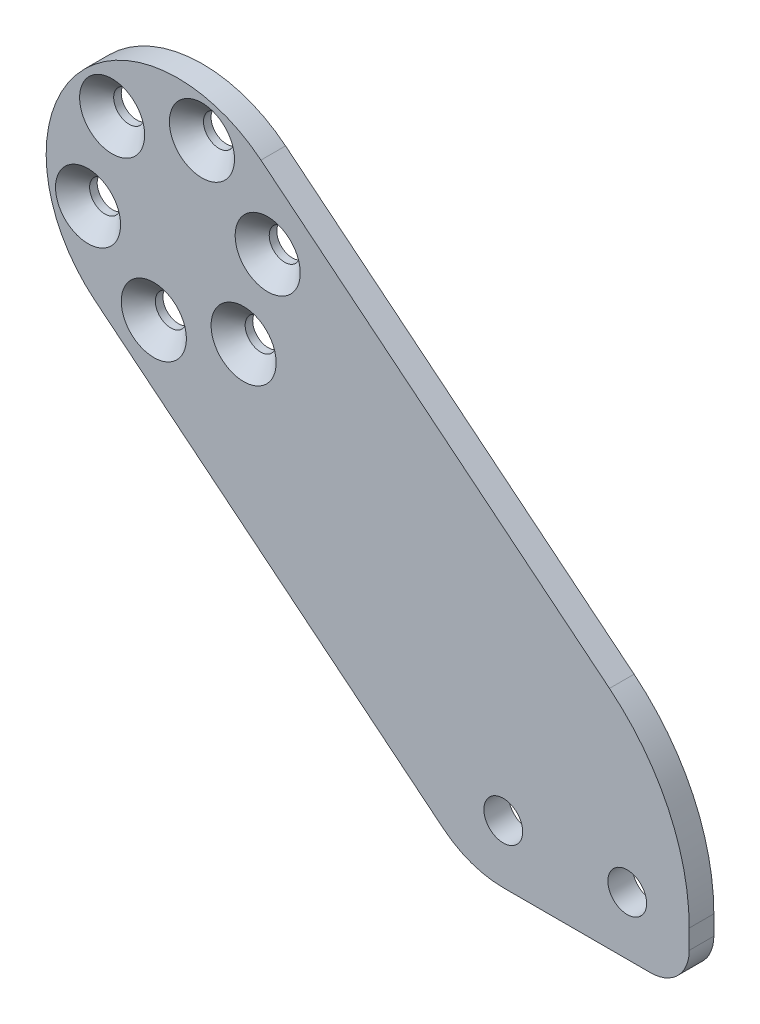
ISO-10303-21;
HEADER;
FILE_DESCRIPTION(('STEP AP214'),'2;1');
FILE_NAME('part.step','',(''),(''),'','','');
FILE_SCHEMA(('AUTOMOTIVE_DESIGN { 1 0 10303 214 1 1 1 1 }'));
ENDSEC;
DATA;
#1=APPLICATION_CONTEXT('core data for automotive mechanical design processes');
#2=APPLICATION_PROTOCOL_DEFINITION('international standard','automotive_design',2000,#1);
#3=PRODUCT_CONTEXT('',#1,'mechanical');
#4=PRODUCT('Part','Part','',(#3));
#5=PRODUCT_RELATED_PRODUCT_CATEGORY('part','',(#4));
#6=PRODUCT_DEFINITION_FORMATION('','',#4);
#7=PRODUCT_DEFINITION_CONTEXT('part definition',#1,'design');
#8=PRODUCT_DEFINITION('design','',#6,#7);
#9=PRODUCT_DEFINITION_SHAPE('','',#8);
#10=(LENGTH_UNIT() NAMED_UNIT(*) SI_UNIT(.MILLI.,.METRE.));
#11=(NAMED_UNIT(*) PLANE_ANGLE_UNIT() SI_UNIT($,.RADIAN.));
#12=(NAMED_UNIT(*) SI_UNIT($,.STERADIAN.) SOLID_ANGLE_UNIT());
#13=UNCERTAINTY_MEASURE_WITH_UNIT(LENGTH_MEASURE(1.E-05),#10,'distance_accuracy_value','');
#14=(GEOMETRIC_REPRESENTATION_CONTEXT(3) GLOBAL_UNCERTAINTY_ASSIGNED_CONTEXT((#13)) GLOBAL_UNIT_ASSIGNED_CONTEXT((#10,
#11,#12)) REPRESENTATION_CONTEXT('',''));
#15=CARTESIAN_POINT('',(0.,0.,0.));
#16=DIRECTION('',(0.,0.,1.));
#17=DIRECTION('',(1.,0.,0.));
#18=AXIS2_PLACEMENT_3D('',#15,#16,#17);
#19=CARTESIAN_POINT('',(38.1233103289566,-45.,3.175));
#20=DIRECTION('',(0.,0.,-1.));
#21=DIRECTION('',(-1.,0.,0.));
#22=AXIS2_PLACEMENT_3D('',#19,#20,#21);
#23=PLANE('',#22);
#24=CARTESIAN_POINT('',(8.48528137423854,-8.48528137423861,3.175));
#25=DIRECTION('',(0.,0.,-1.));
#26=DIRECTION('',(-1.,0.,0.));
#27=AXIS2_PLACEMENT_3D('',#24,#25,#26);
#28=CIRCLE('',#27,4.19999999999997);
#29=CARTESIAN_POINT('',(4.28528137423857,-8.48528137423861,3.175));
#30=VERTEX_POINT('',#29);
#31=EDGE_CURVE('E163',#30,#30,#28,.T.);
#32=ORIENTED_EDGE('',*,*,#31,.T.);
#33=EDGE_LOOP('',(#32));
#34=FACE_BOUND('',#33,.T.);
#35=CARTESIAN_POINT('',(-3.10582854123031,-11.5911099154688,3.175));
#36=DIRECTION('',(0.,0.,-1.));
#37=DIRECTION('',(-1.,0.,0.));
#38=AXIS2_PLACEMENT_3D('',#35,#36,#37);
#39=CIRCLE('',#38,4.19999999999997);
#40=CARTESIAN_POINT('',(-7.30582854123027,-11.5911099154688,3.175));
#41=VERTEX_POINT('',#40);
#42=EDGE_CURVE('E160',#41,#41,#39,.T.);
#43=ORIENTED_EDGE('',*,*,#42,.T.);
#44=EDGE_LOOP('',(#43));
#45=FACE_BOUND('',#44,.T.);
#46=CARTESIAN_POINT('',(-11.5911099154688,-3.10582854123021,3.175));
#47=DIRECTION('',(0.,0.,-1.));
#48=DIRECTION('',(-1.,0.,0.));
#49=AXIS2_PLACEMENT_3D('',#46,#47,#48);
#50=CIRCLE('',#49,4.2);
#51=CARTESIAN_POINT('',(-15.7911099154688,-3.10582854123021,3.175));
#52=VERTEX_POINT('',#51);
#53=EDGE_CURVE('E157',#52,#52,#50,.T.);
#54=ORIENTED_EDGE('',*,*,#53,.T.);
#55=EDGE_LOOP('',(#54));
#56=FACE_BOUND('',#55,.T.);
#57=CARTESIAN_POINT('',(-8.48528137423853,8.48528137423861,3.175));
#58=DIRECTION('',(0.,0.,-1.));
#59=DIRECTION('',(-1.,0.,0.));
#60=AXIS2_PLACEMENT_3D('',#57,#58,#59);
#61=CIRCLE('',#60,4.20000000000001);
#62=CARTESIAN_POINT('',(-12.6852813742385,8.48528137423861,3.175));
#63=VERTEX_POINT('',#62);
#64=EDGE_CURVE('E154',#63,#63,#61,.T.);
#65=ORIENTED_EDGE('',*,*,#64,.T.);
#66=EDGE_LOOP('',(#65));
#67=FACE_BOUND('',#66,.T.);
#68=CARTESIAN_POINT('',(11.5911099154688,3.10582854123019,3.175));
#69=DIRECTION('',(0.,0.,-1.));
#70=DIRECTION('',(-1.,0.,0.));
#71=AXIS2_PLACEMENT_3D('',#68,#69,#70);
#72=CIRCLE('',#71,4.2);
#73=CARTESIAN_POINT('',(7.39110991546884,3.10582854123019,3.175));
#74=VERTEX_POINT('',#73);
#75=EDGE_CURVE('E151',#74,#74,#72,.T.);
#76=ORIENTED_EDGE('',*,*,#75,.T.);
#77=EDGE_LOOP('',(#76));
#78=FACE_BOUND('',#77,.T.);
#79=CARTESIAN_POINT('',(3.1058285412303,11.5911099154688,3.175));
#80=DIRECTION('',(0.,0.,-1.));
#81=DIRECTION('',(-1.,0.,0.));
#82=AXIS2_PLACEMENT_3D('',#79,#80,#81);
#83=CIRCLE('',#82,4.20000000000001);
#84=CARTESIAN_POINT('',(7.30582854123031,11.5911099154688,3.175));
#85=VERTEX_POINT('',#84);
#86=EDGE_CURVE('E148',#85,#85,#83,.T.);
#87=ORIENTED_EDGE('',*,*,#86,.T.);
#88=EDGE_LOOP('',(#87));
#89=FACE_BOUND('',#88,.T.);
#90=DIRECTION('',(1.,0.,0.));
#91=VECTOR('',#90,1.);
#92=CARTESIAN_POINT('',(42.,-52.5,3.175));
#93=LINE('',#92,#91);
#94=CARTESIAN_POINT('',(42.,-52.5000000000001,3.175));
#95=VERTEX_POINT('',#94);
#96=CARTESIAN_POINT('',(61.,-52.5,3.175));
#97=VERTEX_POINT('',#96);
#98=EDGE_CURVE('E310',#95,#97,#93,.T.);
#99=ORIENTED_EDGE('',*,*,#98,.T.);
#100=CARTESIAN_POINT('',(61.,-47.5,3.175));
#101=DIRECTION('',(0.,0.,-1.));
#102=DIRECTION('',(-1.,0.,0.));
#103=AXIS2_PLACEMENT_3D('',#100,#101,#102);
#104=CIRCLE('',#103,5.);
#105=CARTESIAN_POINT('',(66.,-47.5,3.175));
#106=VERTEX_POINT('',#105);
#107=EDGE_CURVE('E143',#97,#106,#104,.F.);
#108=ORIENTED_EDGE('',*,*,#107,.T.);
#109=DIRECTION('',(0.,1.,0.));
#110=VECTOR('',#109,1.);
#111=CARTESIAN_POINT('',(66.,-45.,3.175));
#112=LINE('',#111,#110);
#113=CARTESIAN_POINT('',(66.,-45.,3.175));
#114=VERTEX_POINT('',#113);
#115=EDGE_CURVE('E124',#106,#114,#112,.T.);
#116=ORIENTED_EDGE('',*,*,#115,.T.);
#117=CARTESIAN_POINT('',(38.1233103289566,-45.,3.175));
#118=DIRECTION('',(0.,0.,1.));
#119=DIRECTION('',(-1.,0.,0.));
#120=AXIS2_PLACEMENT_3D('',#117,#118,#119);
#121=CIRCLE('',#120,27.8766896710434);
#122=CARTESIAN_POINT('',(55.7051915212923,-23.3669863228849,3.175));
#123=VERTEX_POINT('',#122);
#124=EDGE_CURVE('E119',#114,#123,#121,.T.);
#125=ORIENTED_EDGE('',*,*,#124,.T.);
#126=DIRECTION('',(-0.776025199993032,0.63070190183301,0.));
#127=VECTOR('',#126,1.);
#128=CARTESIAN_POINT('',(55.7051915212923,-23.3669863228849,3.175));
#129=LINE('',#128,#127);
#130=CARTESIAN_POINT('',(10.7219323311611,13.1924283998815,3.175));
#131=VERTEX_POINT('',#130);
#132=EDGE_CURVE('E108',#123,#131,#129,.T.);
#133=ORIENTED_EDGE('',*,*,#132,.T.);
#134=CARTESIAN_POINT('',(0.,0.,3.175));
#135=DIRECTION('',(0.,0.,1.));
#136=DIRECTION('',(1.,0.,0.));
#137=AXIS2_PLACEMENT_3D('',#134,#135,#136);
#138=CIRCLE('',#137,17.);
#139=CARTESIAN_POINT('',(-10.7219323311612,-13.1924283998815,3.175));
#140=VERTEX_POINT('',#139);
#141=EDGE_CURVE('E118',#131,#140,#138,.T.);
#142=ORIENTED_EDGE('',*,*,#141,.T.);
#143=DIRECTION('',(0.776025199993032,-0.63070190183301,0.));
#144=VECTOR('',#143,1.);
#145=CARTESIAN_POINT('',(34.26132685897,-49.751843122648,3.175));
#146=LINE('',#145,#144);
#147=CARTESIAN_POINT('',(34.26132685897,-49.751843122648,3.175));
#148=VERTEX_POINT('',#147);
#149=EDGE_CURVE('E306',#140,#148,#146,.T.);
#150=ORIENTED_EDGE('',*,*,#149,.T.);
#151=CARTESIAN_POINT('',(42.,-40.2300621441937,3.175));
#152=DIRECTION('',(0.,0.,1.));
#153=DIRECTION('',(1.,0.,0.));
#154=AXIS2_PLACEMENT_3D('',#151,#152,#153);
#155=CIRCLE('',#154,12.2699378558064);
#156=EDGE_CURVE('E308',#148,#95,#155,.T.);
#157=ORIENTED_EDGE('',*,*,#156,.T.);
#158=EDGE_LOOP('',(#99,#108,#116,#125,#133,#142,#150,#157));
#159=FACE_BOUND('',#158,.T.);
#160=CARTESIAN_POINT('',(58.,-45.,3.175));
#161=DIRECTION('',(0.,0.,1.));
#162=DIRECTION('',(1.,0.,0.));
#163=AXIS2_PLACEMENT_3D('',#160,#161,#162);
#164=CIRCLE('',#163,2.49999999999994);
#165=CARTESIAN_POINT('',(60.4999999999999,-45.,3.175));
#166=VERTEX_POINT('',#165);
#167=EDGE_CURVE('E300',#166,#166,#164,.T.);
#168=ORIENTED_EDGE('',*,*,#167,.F.);
#169=EDGE_LOOP('',(#168));
#170=FACE_BOUND('',#169,.T.);
#171=CARTESIAN_POINT('',(42.,-45.,3.175));
#172=DIRECTION('',(0.,0.,1.));
#173=DIRECTION('',(1.,0.,0.));
#174=AXIS2_PLACEMENT_3D('',#171,#172,#173);
#175=CIRCLE('',#174,2.49999999999994);
#176=CARTESIAN_POINT('',(44.4999999999999,-45.,3.175));
#177=VERTEX_POINT('',#176);
#178=EDGE_CURVE('E294',#177,#177,#175,.T.);
#179=ORIENTED_EDGE('',*,*,#178,.F.);
#180=EDGE_LOOP('',(#179));
#181=FACE_BOUND('',#180,.T.);
#182=ADVANCED_FACE('F40',(#34,#45,#56,#67,#78,#89,#159,#170,#181),#23,.F.);
#183=CARTESIAN_POINT('',(38.1233103289566,-45.,0.));
#184=DIRECTION('',(0.,0.,-1.));
#185=DIRECTION('',(-1.,0.,0.));
#186=AXIS2_PLACEMENT_3D('',#183,#184,#185);
#187=PLANE('',#186);
#188=CARTESIAN_POINT('',(-3.10582854123031,-11.5911099154688,0.));
#189=DIRECTION('',(0.,0.,1.));
#190=DIRECTION('',(1.,0.,0.));
#191=AXIS2_PLACEMENT_3D('',#188,#189,#190);
#192=CIRCLE('',#191,2.);
#193=CARTESIAN_POINT('',(-1.10582854123031,-11.5911099154688,0.));
#194=VERTEX_POINT('',#193);
#195=EDGE_CURVE('E276',#194,#194,#192,.T.);
#196=ORIENTED_EDGE('',*,*,#195,.T.);
#197=EDGE_LOOP('',(#196));
#198=FACE_BOUND('',#197,.T.);
#199=CARTESIAN_POINT('',(11.5911099154688,3.10582854123019,0.));
#200=DIRECTION('',(0.,0.,1.));
#201=DIRECTION('',(1.,0.,0.));
#202=AXIS2_PLACEMENT_3D('',#199,#200,#201);
#203=CIRCLE('',#202,2.00000000000001);
#204=CARTESIAN_POINT('',(13.5911099154688,3.10582854123019,0.));
#205=VERTEX_POINT('',#204);
#206=EDGE_CURVE('E284',#205,#205,#203,.T.);
#207=ORIENTED_EDGE('',*,*,#206,.T.);
#208=EDGE_LOOP('',(#207));
#209=FACE_BOUND('',#208,.T.);
#210=CARTESIAN_POINT('',(-8.48528137423853,8.48528137423861,0.));
#211=DIRECTION('',(0.,0.,1.));
#212=DIRECTION('',(1.,0.,0.));
#213=AXIS2_PLACEMENT_3D('',#210,#211,#212);
#214=CIRCLE('',#213,2.00000000000003);
#215=CARTESIAN_POINT('',(-6.4852813742385,8.48528137423861,0.));
#216=VERTEX_POINT('',#215);
#217=EDGE_CURVE('E290',#216,#216,#214,.T.);
#218=ORIENTED_EDGE('',*,*,#217,.T.);
#219=EDGE_LOOP('',(#218));
#220=FACE_BOUND('',#219,.T.);
#221=CARTESIAN_POINT('',(58.,-45.,0.));
#222=DIRECTION('',(0.,0.,1.));
#223=DIRECTION('',(1.,0.,0.));
#224=AXIS2_PLACEMENT_3D('',#221,#222,#223);
#225=CIRCLE('',#224,2.49999999999994);
#226=CARTESIAN_POINT('',(60.4999999999999,-45.,0.));
#227=VERTEX_POINT('',#226);
#228=EDGE_CURVE('E297',#227,#227,#225,.T.);
#229=ORIENTED_EDGE('',*,*,#228,.T.);
#230=EDGE_LOOP('',(#229));
#231=FACE_BOUND('',#230,.T.);
#232=DIRECTION('',(0.,1.,0.));
#233=VECTOR('',#232,1.);
#234=CARTESIAN_POINT('',(66.,-45.,0.));
#235=LINE('',#234,#233);
#236=CARTESIAN_POINT('',(66.,-47.5,0.));
#237=VERTEX_POINT('',#236);
#238=CARTESIAN_POINT('',(66.,-45.,0.));
#239=VERTEX_POINT('',#238);
#240=EDGE_CURVE('E128',#237,#239,#235,.T.);
#241=ORIENTED_EDGE('',*,*,#240,.F.);
#242=CARTESIAN_POINT('',(61.,-47.5,0.));
#243=DIRECTION('',(0.,0.,-1.));
#244=DIRECTION('',(-1.,0.,0.));
#245=AXIS2_PLACEMENT_3D('',#242,#243,#244);
#246=CIRCLE('',#245,5.);
#247=CARTESIAN_POINT('',(61.,-52.5,0.));
#248=VERTEX_POINT('',#247);
#249=EDGE_CURVE('E64',#237,#248,#246,.T.);
#250=ORIENTED_EDGE('',*,*,#249,.T.);
#251=DIRECTION('',(1.,0.,0.));
#252=VECTOR('',#251,1.);
#253=CARTESIAN_POINT('',(42.,-52.5,0.));
#254=LINE('',#253,#252);
#255=CARTESIAN_POINT('',(42.,-52.5000000000001,0.));
#256=VERTEX_POINT('',#255);
#257=EDGE_CURVE('E323',#256,#248,#254,.T.);
#258=ORIENTED_EDGE('',*,*,#257,.F.);
#259=CARTESIAN_POINT('',(42.,-40.2300621441937,0.));
#260=DIRECTION('',(0.,0.,1.));
#261=DIRECTION('',(1.,0.,0.));
#262=AXIS2_PLACEMENT_3D('',#259,#260,#261);
#263=CIRCLE('',#262,12.2699378558064);
#264=CARTESIAN_POINT('',(34.26132685897,-49.751843122648,0.));
#265=VERTEX_POINT('',#264);
#266=EDGE_CURVE('E321',#265,#256,#263,.T.);
#267=ORIENTED_EDGE('',*,*,#266,.F.);
#268=DIRECTION('',(0.776025199993032,-0.63070190183301,0.));
#269=VECTOR('',#268,1.);
#270=CARTESIAN_POINT('',(34.26132685897,-49.751843122648,0.));
#271=LINE('',#270,#269);
#272=CARTESIAN_POINT('',(-10.7219323311612,-13.1924283998815,0.));
#273=VERTEX_POINT('',#272);
#274=EDGE_CURVE('E319',#273,#265,#271,.T.);
#275=ORIENTED_EDGE('',*,*,#274,.F.);
#276=CARTESIAN_POINT('',(0.,0.,0.));
#277=DIRECTION('',(0.,0.,1.));
#278=DIRECTION('',(1.,0.,0.));
#279=AXIS2_PLACEMENT_3D('',#276,#277,#278);
#280=CIRCLE('',#279,17.);
#281=CARTESIAN_POINT('',(10.7219323311611,13.1924283998815,0.));
#282=VERTEX_POINT('',#281);
#283=EDGE_CURVE('E317',#282,#273,#280,.T.);
#284=ORIENTED_EDGE('',*,*,#283,.F.);
#285=DIRECTION('',(-0.776025199993032,0.63070190183301,0.));
#286=VECTOR('',#285,1.);
#287=CARTESIAN_POINT('',(55.7051915212923,-23.3669863228849,0.));
#288=LINE('',#287,#286);
#289=CARTESIAN_POINT('',(55.7051915212923,-23.3669863228849,0.));
#290=VERTEX_POINT('',#289);
#291=EDGE_CURVE('E315',#290,#282,#288,.T.);
#292=ORIENTED_EDGE('',*,*,#291,.F.);
#293=CARTESIAN_POINT('',(38.1233103289566,-45.,0.));
#294=DIRECTION('',(0.,0.,1.));
#295=DIRECTION('',(-1.,0.,0.));
#296=AXIS2_PLACEMENT_3D('',#293,#294,#295);
#297=CIRCLE('',#296,27.8766896710434);
#298=EDGE_CURVE('E132',#239,#290,#297,.T.);
#299=ORIENTED_EDGE('',*,*,#298,.F.);
#300=EDGE_LOOP('',(#241,#250,#258,#267,#275,#284,#292,#299));
#301=FACE_BOUND('',#300,.T.);
#302=CARTESIAN_POINT('',(42.,-45.,0.));
#303=DIRECTION('',(0.,0.,1.));
#304=DIRECTION('',(1.,0.,0.));
#305=AXIS2_PLACEMENT_3D('',#302,#303,#304);
#306=CIRCLE('',#305,2.49999999999994);
#307=CARTESIAN_POINT('',(44.4999999999999,-45.,0.));
#308=VERTEX_POINT('',#307);
#309=EDGE_CURVE('E293',#308,#308,#306,.T.);
#310=ORIENTED_EDGE('',*,*,#309,.T.);
#311=EDGE_LOOP('',(#310));
#312=FACE_BOUND('',#311,.T.);
#313=CARTESIAN_POINT('',(3.1058285412303,11.5911099154688,0.));
#314=DIRECTION('',(0.,0.,1.));
#315=DIRECTION('',(1.,0.,0.));
#316=AXIS2_PLACEMENT_3D('',#313,#314,#315);
#317=CIRCLE('',#316,2.00000000000004);
#318=CARTESIAN_POINT('',(5.10582854123033,11.5911099154688,0.));
#319=VERTEX_POINT('',#318);
#320=EDGE_CURVE('E287',#319,#319,#317,.T.);
#321=ORIENTED_EDGE('',*,*,#320,.T.);
#322=EDGE_LOOP('',(#321));
#323=FACE_BOUND('',#322,.T.);
#324=CARTESIAN_POINT('',(8.48528137423854,-8.48528137423861,0.));
#325=DIRECTION('',(0.,0.,1.));
#326=DIRECTION('',(1.,0.,0.));
#327=AXIS2_PLACEMENT_3D('',#324,#325,#326);
#328=CIRCLE('',#327,1.99999999999999);
#329=CARTESIAN_POINT('',(10.4852813742385,-8.48528137423861,0.));
#330=VERTEX_POINT('',#329);
#331=EDGE_CURVE('E279',#330,#330,#328,.T.);
#332=ORIENTED_EDGE('',*,*,#331,.T.);
#333=EDGE_LOOP('',(#332));
#334=FACE_BOUND('',#333,.T.);
#335=CARTESIAN_POINT('',(-11.5911099154688,-3.10582854123021,0.));
#336=DIRECTION('',(0.,0.,1.));
#337=DIRECTION('',(1.,0.,0.));
#338=AXIS2_PLACEMENT_3D('',#335,#336,#337);
#339=CIRCLE('',#338,2.00000000000001);
#340=CARTESIAN_POINT('',(-9.59110991546882,-3.10582854123021,0.));
#341=VERTEX_POINT('',#340);
#342=EDGE_CURVE('E274',#341,#341,#339,.T.);
#343=ORIENTED_EDGE('',*,*,#342,.T.);
#344=EDGE_LOOP('',(#343));
#345=FACE_BOUND('',#344,.T.);
#346=ADVANCED_FACE('F195',(#198,#209,#220,#231,#301,#312,#323,#334,#345),#187,.T.);
#347=CARTESIAN_POINT('',(38.1233103289566,-45.,3.175));
#348=DIRECTION('',(0.,0.,-1.));
#349=DIRECTION('',(-1.,0.,0.));
#350=AXIS2_PLACEMENT_3D('',#347,#348,#349);
#351=CYLINDRICAL_SURFACE('',#350,27.8766896710434);
#352=ORIENTED_EDGE('',*,*,#298,.T.);
#353=DIRECTION('',(0.,0.,-1.));
#354=VECTOR('',#353,1.);
#355=CARTESIAN_POINT('',(55.7051915212923,-23.3669863228849,3.175));
#356=LINE('',#355,#354);
#357=EDGE_CURVE('E112',#123,#290,#356,.T.);
#358=ORIENTED_EDGE('',*,*,#357,.F.);
#359=ORIENTED_EDGE('',*,*,#124,.F.);
#360=DIRECTION('',(0.,0.,-1.));
#361=VECTOR('',#360,1.);
#362=CARTESIAN_POINT('',(66.,-45.,3.175));
#363=LINE('',#362,#361);
#364=EDGE_CURVE('E313',#114,#239,#363,.T.);
#365=ORIENTED_EDGE('',*,*,#364,.T.);
#366=EDGE_LOOP('',(#352,#358,#359,#365));
#367=FACE_BOUND('',#366,.T.);
#368=ADVANCED_FACE('F130',(#367),#351,.T.);
#369=CARTESIAN_POINT('',(55.7051915212923,-23.3669863228849,3.175));
#370=DIRECTION('',(-0.630701901833009,-0.776025199993032,0.));
#371=DIRECTION('',(0.776025199993032,-0.63070190183301,0.));
#372=AXIS2_PLACEMENT_3D('',#369,#370,#371);
#373=PLANE('',#372);
#374=ORIENTED_EDGE('',*,*,#291,.T.);
#375=DIRECTION('',(0.,0.,-1.));
#376=VECTOR('',#375,1.);
#377=CARTESIAN_POINT('',(10.7219323311611,13.1924283998815,3.175));
#378=LINE('',#377,#376);
#379=EDGE_CURVE('E115',#131,#282,#378,.T.);
#380=ORIENTED_EDGE('',*,*,#379,.F.);
#381=ORIENTED_EDGE('',*,*,#132,.F.);
#382=ORIENTED_EDGE('',*,*,#357,.T.);
#383=EDGE_LOOP('',(#374,#380,#381,#382));
#384=FACE_BOUND('',#383,.T.);
#385=ADVANCED_FACE('F110',(#384),#373,.F.);
#386=CARTESIAN_POINT('',(0.,0.,3.175));
#387=DIRECTION('',(0.,0.,-1.));
#388=DIRECTION('',(-1.,0.,0.));
#389=AXIS2_PLACEMENT_3D('',#386,#387,#388);
#390=CYLINDRICAL_SURFACE('',#389,17.);
#391=ORIENTED_EDGE('',*,*,#283,.T.);
#392=DIRECTION('',(0.,0.,-1.));
#393=VECTOR('',#392,1.);
#394=CARTESIAN_POINT('',(-10.7219323311612,-13.1924283998815,3.175));
#395=LINE('',#394,#393);
#396=EDGE_CURVE('E137',#140,#273,#395,.T.);
#397=ORIENTED_EDGE('',*,*,#396,.F.);
#398=ORIENTED_EDGE('',*,*,#141,.F.);
#399=ORIENTED_EDGE('',*,*,#379,.T.);
#400=EDGE_LOOP('',(#391,#397,#398,#399));
#401=FACE_BOUND('',#400,.T.);
#402=ADVANCED_FACE('F222',(#401),#390,.T.);
#403=CARTESIAN_POINT('',(34.26132685897,-49.751843122648,3.175));
#404=DIRECTION('',(0.63070190183301,0.776025199993032,0.));
#405=DIRECTION('',(-0.776025199993032,0.63070190183301,0.));
#406=AXIS2_PLACEMENT_3D('',#403,#404,#405);
#407=PLANE('',#406);
#408=ORIENTED_EDGE('',*,*,#274,.T.);
#409=DIRECTION('',(0.,0.,-1.));
#410=VECTOR('',#409,1.);
#411=CARTESIAN_POINT('',(34.26132685897,-49.751843122648,3.175));
#412=LINE('',#411,#410);
#413=EDGE_CURVE('E330',#148,#265,#412,.T.);
#414=ORIENTED_EDGE('',*,*,#413,.F.);
#415=ORIENTED_EDGE('',*,*,#149,.F.);
#416=ORIENTED_EDGE('',*,*,#396,.T.);
#417=EDGE_LOOP('',(#408,#414,#415,#416));
#418=FACE_BOUND('',#417,.T.);
#419=ADVANCED_FACE('F218',(#418),#407,.F.);
#420=CARTESIAN_POINT('',(42.,-40.2300621441937,3.175));
#421=DIRECTION('',(0.,0.,-1.));
#422=DIRECTION('',(-1.,0.,0.));
#423=AXIS2_PLACEMENT_3D('',#420,#421,#422);
#424=CYLINDRICAL_SURFACE('',#423,12.2699378558064);
#425=ORIENTED_EDGE('',*,*,#266,.T.);
#426=DIRECTION('',(0.,0.,-1.));
#427=VECTOR('',#426,1.);
#428=CARTESIAN_POINT('',(42.,-52.5000000000001,3.175));
#429=LINE('',#428,#427);
#430=EDGE_CURVE('E327',#95,#256,#429,.T.);
#431=ORIENTED_EDGE('',*,*,#430,.F.);
#432=ORIENTED_EDGE('',*,*,#156,.F.);
#433=ORIENTED_EDGE('',*,*,#413,.T.);
#434=EDGE_LOOP('',(#425,#431,#432,#433));
#435=FACE_BOUND('',#434,.T.);
#436=ADVANCED_FACE('F215',(#435),#424,.T.);
#437=CARTESIAN_POINT('',(42.,-52.5,3.175));
#438=DIRECTION('',(0.,1.,0.));
#439=DIRECTION('',(0.,0.,1.));
#440=AXIS2_PLACEMENT_3D('',#437,#438,#439);
#441=PLANE('',#440);
#442=ORIENTED_EDGE('',*,*,#257,.T.);
#443=DIRECTION('',(0.,0.,-1.));
#444=VECTOR('',#443,1.);
#445=CARTESIAN_POINT('',(61.,-52.5,3.175));
#446=LINE('',#445,#444);
#447=EDGE_CURVE('E56',#248,#97,#446,.F.);
#448=ORIENTED_EDGE('',*,*,#447,.T.);
#449=ORIENTED_EDGE('',*,*,#98,.F.);
#450=ORIENTED_EDGE('',*,*,#430,.T.);
#451=EDGE_LOOP('',(#442,#448,#449,#450));
#452=FACE_BOUND('',#451,.T.);
#453=ADVANCED_FACE('F211',(#452),#441,.F.);
#454=CARTESIAN_POINT('',(66.,-45.,3.175));
#455=DIRECTION('',(-1.,0.,0.));
#456=DIRECTION('',(0.,-1.,0.));
#457=AXIS2_PLACEMENT_3D('',#454,#455,#456);
#458=PLANE('',#457);
#459=ORIENTED_EDGE('',*,*,#115,.F.);
#460=DIRECTION('',(0.,0.,-1.));
#461=VECTOR('',#460,1.);
#462=CARTESIAN_POINT('',(66.,-47.5,3.175));
#463=LINE('',#462,#461);
#464=EDGE_CURVE('E133',#106,#237,#463,.T.);
#465=ORIENTED_EDGE('',*,*,#464,.T.);
#466=ORIENTED_EDGE('',*,*,#240,.T.);
#467=ORIENTED_EDGE('',*,*,#364,.F.);
#468=EDGE_LOOP('',(#459,#465,#466,#467));
#469=FACE_BOUND('',#468,.T.);
#470=ADVANCED_FACE('F208',(#469),#458,.F.);
#471=CARTESIAN_POINT('',(58.,-45.,3.175));
#472=DIRECTION('',(0.,0.,-1.));
#473=DIRECTION('',(-1.,0.,0.));
#474=AXIS2_PLACEMENT_3D('',#471,#472,#473);
#475=CYLINDRICAL_SURFACE('',#474,2.49999999999994);
#476=ORIENTED_EDGE('',*,*,#167,.T.);
#477=EDGE_LOOP('',(#476));
#478=FACE_BOUND('',#477,.T.);
#479=ORIENTED_EDGE('',*,*,#228,.F.);
#480=EDGE_LOOP('',(#479));
#481=FACE_BOUND('',#480,.T.);
#482=ADVANCED_FACE('F205',(#478,#481),#475,.F.);
#483=CARTESIAN_POINT('',(42.,-45.,3.175));
#484=DIRECTION('',(0.,0.,-1.));
#485=DIRECTION('',(-1.,0.,0.));
#486=AXIS2_PLACEMENT_3D('',#483,#484,#485);
#487=CYLINDRICAL_SURFACE('',#486,2.49999999999994);
#488=ORIENTED_EDGE('',*,*,#178,.T.);
#489=EDGE_LOOP('',(#488));
#490=FACE_BOUND('',#489,.T.);
#491=ORIENTED_EDGE('',*,*,#309,.F.);
#492=EDGE_LOOP('',(#491));
#493=FACE_BOUND('',#492,.T.);
#494=ADVANCED_FACE('F368',(#490,#493),#487,.F.);
#495=CARTESIAN_POINT('',(-8.48528137423853,8.48528137423861,3.175));
#496=DIRECTION('',(0.,0.,-1.));
#497=DIRECTION('',(-1.,0.,0.));
#498=AXIS2_PLACEMENT_3D('',#495,#496,#497);
#499=CYLINDRICAL_SURFACE('',#498,2.00000000000003);
#500=CARTESIAN_POINT('',(-8.48528137423853,8.48528137423861,0.97500000000003));
#501=DIRECTION('',(0.,0.,-1.));
#502=DIRECTION('',(-1.,0.,0.));
#503=AXIS2_PLACEMENT_3D('',#500,#501,#502);
#504=CIRCLE('',#503,2.00000000000003);
#505=CARTESIAN_POINT('',(-10.4852813742386,8.48528137423861,0.97500000000003));
#506=VERTEX_POINT('',#505);
#507=EDGE_CURVE('E172',#506,#506,#504,.F.);
#508=ORIENTED_EDGE('',*,*,#507,.T.);
#509=EDGE_LOOP('',(#508));
#510=FACE_BOUND('',#509,.T.);
#511=ORIENTED_EDGE('',*,*,#217,.F.);
#512=EDGE_LOOP('',(#511));
#513=FACE_BOUND('',#512,.T.);
#514=ADVANCED_FACE('F365',(#510,#513),#499,.F.);
#515=CARTESIAN_POINT('',(3.1058285412303,11.5911099154688,3.175));
#516=DIRECTION('',(0.,0.,-1.));
#517=DIRECTION('',(-1.,0.,0.));
#518=AXIS2_PLACEMENT_3D('',#515,#516,#517);
#519=CYLINDRICAL_SURFACE('',#518,2.00000000000004);
#520=CARTESIAN_POINT('',(3.1058285412303,11.5911099154688,0.975000000000032));
#521=DIRECTION('',(0.,0.,-1.));
#522=DIRECTION('',(-1.,0.,0.));
#523=AXIS2_PLACEMENT_3D('',#520,#521,#522);
#524=CIRCLE('',#523,2.00000000000004);
#525=CARTESIAN_POINT('',(5.10582854123033,11.5911099154688,0.975000000000032));
#526=VERTEX_POINT('',#525);
#527=EDGE_CURVE('E11',#526,#526,#524,.F.);
#528=ORIENTED_EDGE('',*,*,#527,.T.);
#529=EDGE_LOOP('',(#528));
#530=FACE_BOUND('',#529,.T.);
#531=ORIENTED_EDGE('',*,*,#320,.F.);
#532=EDGE_LOOP('',(#531));
#533=FACE_BOUND('',#532,.T.);
#534=ADVANCED_FACE('F360',(#530,#533),#519,.F.);
#535=CARTESIAN_POINT('',(11.5911099154688,3.10582854123019,3.175));
#536=DIRECTION('',(0.,0.,-1.));
#537=DIRECTION('',(-1.,0.,0.));
#538=AXIS2_PLACEMENT_3D('',#535,#536,#537);
#539=CYLINDRICAL_SURFACE('',#538,2.00000000000001);
#540=CARTESIAN_POINT('',(11.5911099154688,3.10582854123019,0.975000000000023));
#541=DIRECTION('',(0.,0.,-1.));
#542=DIRECTION('',(-1.,0.,0.));
#543=AXIS2_PLACEMENT_3D('',#540,#541,#542);
#544=CIRCLE('',#543,2.00000000000001);
#545=CARTESIAN_POINT('',(9.59110991546882,3.10582854123019,0.975000000000023));
#546=VERTEX_POINT('',#545);
#547=EDGE_CURVE('E49',#546,#546,#544,.F.);
#548=ORIENTED_EDGE('',*,*,#547,.T.);
#549=EDGE_LOOP('',(#548));
#550=FACE_BOUND('',#549,.T.);
#551=ORIENTED_EDGE('',*,*,#206,.F.);
#552=EDGE_LOOP('',(#551));
#553=FACE_BOUND('',#552,.T.);
#554=ADVANCED_FACE('F177',(#550,#553),#539,.F.);
#555=CARTESIAN_POINT('',(8.48528137423854,-8.48528137423861,3.175));
#556=DIRECTION('',(0.,0.,-1.));
#557=DIRECTION('',(-1.,0.,0.));
#558=AXIS2_PLACEMENT_3D('',#555,#556,#557);
#559=CYLINDRICAL_SURFACE('',#558,1.99999999999999);
#560=CARTESIAN_POINT('',(8.48528137423854,-8.48528137423861,0.975000000000025));
#561=DIRECTION('',(0.,0.,-1.));
#562=DIRECTION('',(-1.,0.,0.));
#563=AXIS2_PLACEMENT_3D('',#560,#561,#562);
#564=CIRCLE('',#563,1.99999999999999);
#565=CARTESIAN_POINT('',(6.48528137423855,-8.48528137423861,0.975000000000025));
#566=VERTEX_POINT('',#565);
#567=EDGE_CURVE('E145',#566,#566,#564,.F.);
#568=ORIENTED_EDGE('',*,*,#567,.T.);
#569=EDGE_LOOP('',(#568));
#570=FACE_BOUND('',#569,.T.);
#571=ORIENTED_EDGE('',*,*,#331,.F.);
#572=EDGE_LOOP('',(#571));
#573=FACE_BOUND('',#572,.T.);
#574=ADVANCED_FACE('F350',(#570,#573),#559,.F.);
#575=CARTESIAN_POINT('',(-3.10582854123031,-11.5911099154688,3.175));
#576=DIRECTION('',(0.,0.,-1.));
#577=DIRECTION('',(-1.,0.,0.));
#578=AXIS2_PLACEMENT_3D('',#575,#576,#577);
#579=CYLINDRICAL_SURFACE('',#578,2.);
#580=CARTESIAN_POINT('',(-3.10582854123031,-11.5911099154688,0.975000000000036));
#581=DIRECTION('',(0.,0.,-1.));
#582=DIRECTION('',(-1.,0.,0.));
#583=AXIS2_PLACEMENT_3D('',#580,#581,#582);
#584=CIRCLE('',#583,2.);
#585=CARTESIAN_POINT('',(-5.1058285412303,-11.5911099154688,0.975000000000036));
#586=VERTEX_POINT('',#585);
#587=EDGE_CURVE('E166',#586,#586,#584,.F.);
#588=ORIENTED_EDGE('',*,*,#587,.T.);
#589=EDGE_LOOP('',(#588));
#590=FACE_BOUND('',#589,.T.);
#591=ORIENTED_EDGE('',*,*,#195,.F.);
#592=EDGE_LOOP('',(#591));
#593=FACE_BOUND('',#592,.T.);
#594=ADVANCED_FACE('F270',(#590,#593),#579,.F.);
#595=CARTESIAN_POINT('',(-11.5911099154688,-3.10582854123021,3.175));
#596=DIRECTION('',(0.,0.,-1.));
#597=DIRECTION('',(-1.,0.,0.));
#598=AXIS2_PLACEMENT_3D('',#595,#596,#597);
#599=CYLINDRICAL_SURFACE('',#598,2.00000000000001);
#600=CARTESIAN_POINT('',(-11.5911099154688,-3.10582854123021,0.97500000000002));
#601=DIRECTION('',(0.,0.,-1.));
#602=DIRECTION('',(-1.,0.,0.));
#603=AXIS2_PLACEMENT_3D('',#600,#601,#602);
#604=CIRCLE('',#603,2.00000000000001);
#605=CARTESIAN_POINT('',(-13.5911099154688,-3.10582854123021,0.97500000000002));
#606=VERTEX_POINT('',#605);
#607=EDGE_CURVE('E169',#606,#606,#604,.F.);
#608=ORIENTED_EDGE('',*,*,#607,.T.);
#609=EDGE_LOOP('',(#608));
#610=FACE_BOUND('',#609,.T.);
#611=ORIENTED_EDGE('',*,*,#342,.F.);
#612=EDGE_LOOP('',(#611));
#613=FACE_BOUND('',#612,.T.);
#614=ADVANCED_FACE('F235',(#610,#613),#599,.F.);
#615=CARTESIAN_POINT('',(61.,-47.5,3.175));
#616=DIRECTION('',(0.,0.,-1.));
#617=DIRECTION('',(-1.,0.,0.));
#618=AXIS2_PLACEMENT_3D('',#615,#616,#617);
#619=CYLINDRICAL_SURFACE('',#618,5.);
#620=ORIENTED_EDGE('',*,*,#107,.F.);
#621=ORIENTED_EDGE('',*,*,#447,.F.);
#622=ORIENTED_EDGE('',*,*,#249,.F.);
#623=ORIENTED_EDGE('',*,*,#464,.F.);
#624=EDGE_LOOP('',(#620,#621,#622,#623));
#625=FACE_BOUND('',#624,.T.);
#626=ADVANCED_FACE('F231',(#625),#619,.T.);
#627=CARTESIAN_POINT('',(8.48528137423854,-8.48528137423861,0.975000000000025));
#628=DIRECTION('',(0.,0.,1.));
#629=DIRECTION('',(1.,0.,0.));
#630=AXIS2_PLACEMENT_3D('',#627,#628,#629);
#631=CONICAL_SURFACE('',#630,1.99999999999999,0.78539816339745);
#632=ORIENTED_EDGE('',*,*,#31,.F.);
#633=EDGE_LOOP('',(#632));
#634=FACE_BOUND('',#633,.T.);
#635=ORIENTED_EDGE('',*,*,#567,.F.);
#636=EDGE_LOOP('',(#635));
#637=FACE_BOUND('',#636,.T.);
#638=ADVANCED_FACE('F234',(#634,#637),#631,.F.);
#639=CARTESIAN_POINT('',(-3.10582854123031,-11.5911099154688,0.975000000000036));
#640=DIRECTION('',(0.,0.,1.));
#641=DIRECTION('',(1.,0.,0.));
#642=AXIS2_PLACEMENT_3D('',#639,#640,#641);
#643=CONICAL_SURFACE('',#642,2.,0.78539816339745);
#644=ORIENTED_EDGE('',*,*,#42,.F.);
#645=EDGE_LOOP('',(#644));
#646=FACE_BOUND('',#645,.T.);
#647=ORIENTED_EDGE('',*,*,#587,.F.);
#648=EDGE_LOOP('',(#647));
#649=FACE_BOUND('',#648,.T.);
#650=ADVANCED_FACE('F243',(#646,#649),#643,.F.);
#651=CARTESIAN_POINT('',(-11.5911099154688,-3.10582854123021,0.97500000000002));
#652=DIRECTION('',(0.,0.,1.));
#653=DIRECTION('',(1.,0.,0.));
#654=AXIS2_PLACEMENT_3D('',#651,#652,#653);
#655=CONICAL_SURFACE('',#654,2.00000000000001,0.78539816339745);
#656=ORIENTED_EDGE('',*,*,#53,.F.);
#657=EDGE_LOOP('',(#656));
#658=FACE_BOUND('',#657,.T.);
#659=ORIENTED_EDGE('',*,*,#607,.F.);
#660=EDGE_LOOP('',(#659));
#661=FACE_BOUND('',#660,.T.);
#662=ADVANCED_FACE('F189',(#658,#661),#655,.F.);
#663=CARTESIAN_POINT('',(-8.48528137423853,8.48528137423861,0.97500000000003));
#664=DIRECTION('',(0.,0.,1.));
#665=DIRECTION('',(1.,0.,0.));
#666=AXIS2_PLACEMENT_3D('',#663,#664,#665);
#667=CONICAL_SURFACE('',#666,2.00000000000003,0.78539816339745);
#668=ORIENTED_EDGE('',*,*,#64,.F.);
#669=EDGE_LOOP('',(#668));
#670=FACE_BOUND('',#669,.T.);
#671=ORIENTED_EDGE('',*,*,#507,.F.);
#672=EDGE_LOOP('',(#671));
#673=FACE_BOUND('',#672,.T.);
#674=ADVANCED_FACE('F182',(#670,#673),#667,.F.);
#675=CARTESIAN_POINT('',(11.5911099154688,3.10582854123019,0.975000000000023));
#676=DIRECTION('',(0.,0.,1.));
#677=DIRECTION('',(1.,0.,0.));
#678=AXIS2_PLACEMENT_3D('',#675,#676,#677);
#679=CONICAL_SURFACE('',#678,2.00000000000001,0.78539816339745);
#680=ORIENTED_EDGE('',*,*,#75,.F.);
#681=EDGE_LOOP('',(#680));
#682=FACE_BOUND('',#681,.T.);
#683=ORIENTED_EDGE('',*,*,#547,.F.);
#684=EDGE_LOOP('',(#683));
#685=FACE_BOUND('',#684,.T.);
#686=ADVANCED_FACE('F180',(#682,#685),#679,.F.);
#687=CARTESIAN_POINT('',(3.1058285412303,11.5911099154688,0.975000000000032));
#688=DIRECTION('',(0.,0.,1.));
#689=DIRECTION('',(1.,0.,0.));
#690=AXIS2_PLACEMENT_3D('',#687,#688,#689);
#691=CONICAL_SURFACE('',#690,2.00000000000004,0.78539816339745);
#692=CARTESIAN_POINT('',(7.30582854123031,11.5911099154688,3.175));
#693=CARTESIAN_POINT('',(7.28291187456364,11.5911099154688,3.15208333333333));
#694=CARTESIAN_POINT('',(7.25999520789697,11.5911099154688,3.12916666666667));
#695=CARTESIAN_POINT('',(7.21416187456364,11.5911099154688,3.08333333333334));
#696=CARTESIAN_POINT('',(7.19124520789697,11.5911099154688,3.06041666666667));
#697=CARTESIAN_POINT('',(7.14541187456364,11.5911099154688,3.01458333333334));
#698=CARTESIAN_POINT('',(7.12249520789697,11.5911099154688,2.99166666666667));
#699=CARTESIAN_POINT('',(7.07666187456364,11.5911099154688,2.94583333333334));
#700=CARTESIAN_POINT('',(7.05374520789698,11.5911099154688,2.92291666666667));
#701=CARTESIAN_POINT('',(7.00791187456364,11.5911099154688,2.87708333333334));
#702=CARTESIAN_POINT('',(6.98499520789698,11.5911099154688,2.85416666666667));
#703=CARTESIAN_POINT('',(6.93916187456364,11.5911099154688,2.80833333333334));
#704=CARTESIAN_POINT('',(6.91624520789698,11.5911099154688,2.78541666666667));
#705=CARTESIAN_POINT('',(6.87041187456364,11.5911099154688,2.73958333333334));
#706=CARTESIAN_POINT('',(6.84749520789698,11.5911099154688,2.71666666666667));
#707=CARTESIAN_POINT('',(6.80166187456364,11.5911099154688,2.67083333333334));
#708=CARTESIAN_POINT('',(6.77874520789698,11.5911099154688,2.64791666666667));
#709=CARTESIAN_POINT('',(6.73291187456364,11.5911099154688,2.60208333333334));
#710=CARTESIAN_POINT('',(6.70999520789698,11.5911099154688,2.57916666666668));
#711=CARTESIAN_POINT('',(6.66416187456365,11.5911099154688,2.53333333333334));
#712=CARTESIAN_POINT('',(6.64124520789698,11.5911099154688,2.51041666666668));
#713=CARTESIAN_POINT('',(6.59541187456365,11.5911099154688,2.46458333333334));
#714=CARTESIAN_POINT('',(6.57249520789698,11.5911099154688,2.44166666666668));
#715=CARTESIAN_POINT('',(6.52666187456365,11.5911099154688,2.39583333333335));
#716=CARTESIAN_POINT('',(6.50374520789698,11.5911099154688,2.37291666666668));
#717=CARTESIAN_POINT('',(6.45791187456365,11.5911099154688,2.32708333333335));
#718=CARTESIAN_POINT('',(6.43499520789698,11.5911099154688,2.30416666666668));
#719=CARTESIAN_POINT('',(6.38916187456365,11.5911099154688,2.25833333333335));
#720=CARTESIAN_POINT('',(6.36624520789698,11.5911099154688,2.23541666666668));
#721=CARTESIAN_POINT('',(6.32041187456365,11.5911099154688,2.18958333333335));
#722=CARTESIAN_POINT('',(6.29749520789698,11.5911099154688,2.16666666666668));
#723=CARTESIAN_POINT('',(6.25166187456365,11.5911099154688,2.12083333333335));
#724=CARTESIAN_POINT('',(6.22874520789698,11.5911099154688,2.09791666666668));
#725=CARTESIAN_POINT('',(6.18291187456365,11.5911099154688,2.05208333333335));
#726=CARTESIAN_POINT('',(6.15999520789699,11.5911099154688,2.02916666666668));
#727=CARTESIAN_POINT('',(6.11416187456365,11.5911099154688,1.98333333333335));
#728=CARTESIAN_POINT('',(6.09124520789699,11.5911099154688,1.96041666666668));
#729=CARTESIAN_POINT('',(6.04541187456365,11.5911099154688,1.91458333333335));
#730=CARTESIAN_POINT('',(6.02249520789699,11.5911099154688,1.89166666666669));
#731=CARTESIAN_POINT('',(5.97666187456365,11.5911099154688,1.84583333333335));
#732=CARTESIAN_POINT('',(5.95374520789699,11.5911099154688,1.82291666666669));
#733=CARTESIAN_POINT('',(5.90791187456365,11.5911099154688,1.77708333333335));
#734=CARTESIAN_POINT('',(5.88499520789699,11.5911099154688,1.75416666666669));
#735=CARTESIAN_POINT('',(5.83916187456366,11.5911099154688,1.70833333333336));
#736=CARTESIAN_POINT('',(5.81624520789699,11.5911099154688,1.68541666666669));
#737=CARTESIAN_POINT('',(5.77041187456366,11.5911099154688,1.63958333333336));
#738=CARTESIAN_POINT('',(5.74749520789699,11.5911099154688,1.61666666666669));
#739=CARTESIAN_POINT('',(5.70166187456366,11.5911099154688,1.57083333333336));
#740=CARTESIAN_POINT('',(5.67874520789699,11.5911099154688,1.54791666666669));
#741=CARTESIAN_POINT('',(5.63291187456366,11.5911099154688,1.50208333333336));
#742=CARTESIAN_POINT('',(5.60999520789699,11.5911099154688,1.47916666666669));
#743=CARTESIAN_POINT('',(5.56416187456366,11.5911099154688,1.43333333333336));
#744=CARTESIAN_POINT('',(5.54124520789699,11.5911099154688,1.41041666666669));
#745=CARTESIAN_POINT('',(5.49541187456366,11.5911099154688,1.36458333333336));
#746=CARTESIAN_POINT('',(5.47249520789699,11.5911099154688,1.34166666666669));
#747=CARTESIAN_POINT('',(5.42666187456366,11.5911099154688,1.29583333333336));
#748=CARTESIAN_POINT('',(5.40374520789699,11.5911099154688,1.27291666666669));
#749=CARTESIAN_POINT('',(5.35791187456366,11.5911099154688,1.22708333333336));
#750=CARTESIAN_POINT('',(5.33499520789699,11.5911099154688,1.2041666666667));
#751=CARTESIAN_POINT('',(5.28916187456366,11.5911099154688,1.15833333333336));
#752=CARTESIAN_POINT('',(5.266245207897,11.5911099154688,1.1354166666667));
#753=CARTESIAN_POINT('',(5.22041187456366,11.5911099154688,1.08958333333336));
#754=CARTESIAN_POINT('',(5.197495207897,11.5911099154688,1.0666666666667));
#755=CARTESIAN_POINT('',(5.15166187456366,11.5911099154688,1.02083333333337));
#756=CARTESIAN_POINT('',(5.128745207897,11.5911099154688,0.997916666666699));
#757=CARTESIAN_POINT('',(5.10582854123033,11.5911099154688,0.975000000000032));
#758=B_SPLINE_CURVE_WITH_KNOTS('',3,(#692,#693,#694,#695,#696,#697,#698,#699,#700,#701,#702,
#703,#704,#705,#706,#707,#708,#709,#710,#711,#712,#713,#714,#715,#716,#717,#718,#719,#720,#721,
#722,#723,#724,#725,#726,#727,#728,#729,#730,#731,#732,#733,#734,#735,#736,#737,#738,#739,#740,
#741,#742,#743,#744,#745,#746,#747,#748,#749,#750,#751,#752,#753,#754,#755,#756,#757),
.UNSPECIFIED.,.F.,.F.,(4,2,2,2,2,2,2,2,2,2,2,2,2,2,2,2,2,2,2,2,2,2,2,2,2,2,2,2,2,2,2,2,4),(0.,
0.0972271824131491,0.194454364826298,0.291681547239448,0.388908729652597,0.486135912065745,
0.583363094478895,0.680590276892044,0.777817459305193,0.875044641718343,0.972271824131491,
1.06949900654464,1.16672618895779,1.26395337137094,1.36118055378409,1.45840773619724,
1.55563491861039,1.65286210102353,1.75008928343668,1.84731646584983,1.94454364826298,
2.04177083067613,2.13899801308928,2.23622519550243,2.33345237791558,2.43067956032873,
2.52790674274187,2.62513392515502,2.72236110756817,2.81958828998132,2.91681547239447,
3.01404265480762,3.11126983722077),.UNSPECIFIED.);
#759=EDGE_CURVE('BSEAM43',#85,#526,#758,.T.);
#760=ORIENTED_EDGE('',*,*,#86,.F.);
#761=ORIENTED_EDGE('',*,*,#527,.F.);
#762=ORIENTED_EDGE('',*,*,#759,.T.);
#763=ORIENTED_EDGE('',*,*,#759,.F.);
#764=EDGE_LOOP('',(#760,#762,#761,#763));
#765=FACE_BOUND('',#764,.T.);
#766=ADVANCED_FACE('F43',(#765),#691,.F.);
#767=CLOSED_SHELL('',(#182,#346,#368,#385,#402,#419,#436,#453,#470,#482,#494,#514,#534,#554,
#574,#594,#614,#626,#638,#650,#662,#674,#686,#766));
#768=MANIFOLD_SOLID_BREP('B2',#767);
#769=ADVANCED_BREP_SHAPE_REPRESENTATION('',(#18,#768),#14);
#770=SHAPE_DEFINITION_REPRESENTATION(#9,#769);
ENDSEC;
END-ISO-10303-21;
